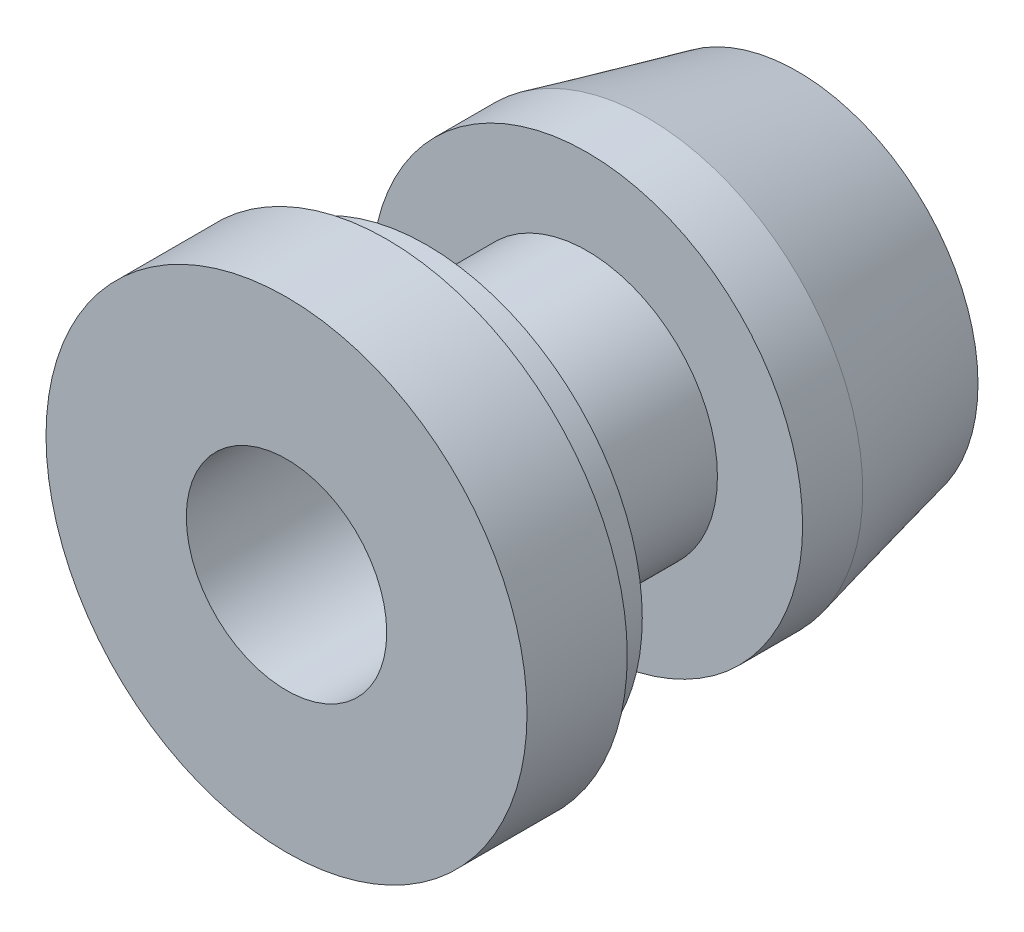
ISO-10303-21;
HEADER;
FILE_DESCRIPTION(('STEP AP214'),'2;1');
FILE_NAME('part.step','',(''),(''),'','','');
FILE_SCHEMA(('AUTOMOTIVE_DESIGN { 1 0 10303 214 1 1 1 1 }'));
ENDSEC;
DATA;
#1=APPLICATION_CONTEXT('core data for automotive mechanical design processes');
#2=APPLICATION_PROTOCOL_DEFINITION('international standard','automotive_design',2000,#1);
#3=PRODUCT_CONTEXT('',#1,'mechanical');
#4=PRODUCT('Part','Part','',(#3));
#5=PRODUCT_RELATED_PRODUCT_CATEGORY('part','',(#4));
#6=PRODUCT_DEFINITION_FORMATION('','',#4);
#7=PRODUCT_DEFINITION_CONTEXT('part definition',#1,'design');
#8=PRODUCT_DEFINITION('design','',#6,#7);
#9=PRODUCT_DEFINITION_SHAPE('','',#8);
#10=(LENGTH_UNIT() NAMED_UNIT(*) SI_UNIT(.MILLI.,.METRE.));
#11=(NAMED_UNIT(*) PLANE_ANGLE_UNIT() SI_UNIT($,.RADIAN.));
#12=(NAMED_UNIT(*) SI_UNIT($,.STERADIAN.) SOLID_ANGLE_UNIT());
#13=UNCERTAINTY_MEASURE_WITH_UNIT(LENGTH_MEASURE(1.E-05),#10,'distance_accuracy_value','');
#14=(GEOMETRIC_REPRESENTATION_CONTEXT(3) GLOBAL_UNCERTAINTY_ASSIGNED_CONTEXT((#13)) GLOBAL_UNIT_ASSIGNED_CONTEXT((#10,
#11,#12)) REPRESENTATION_CONTEXT('',''));
#15=CARTESIAN_POINT('',(0.,0.,0.));
#16=DIRECTION('',(0.,0.,1.));
#17=DIRECTION('',(1.,0.,0.));
#18=AXIS2_PLACEMENT_3D('',#15,#16,#17);
#19=CARTESIAN_POINT('',(0.,0.,-2.9946820181495));
#20=DIRECTION('',(0.,0.,-1.));
#21=DIRECTION('',(-1.,0.,0.));
#22=AXIS2_PLACEMENT_3D('',#19,#20,#21);
#23=CONICAL_SURFACE('',#22,0.,1.56931910907694);
#24=CARTESIAN_POINT('',(0.,0.,-3.));
#25=DIRECTION('',(0.,0.,1.));
#26=DIRECTION('',(1.,0.,0.));
#27=AXIS2_PLACEMENT_3D('',#24,#25,#26);
#28=CIRCLE('',#27,3.59999607209078);
#29=CARTESIAN_POINT('',(3.59999607209078,0.,-3.));
#30=VERTEX_POINT('',#29);
#31=EDGE_CURVE('E57',#30,#30,#28,.T.);
#32=ORIENTED_EDGE('',*,*,#31,.F.);
#33=EDGE_LOOP('',(#32));
#34=FACE_BOUND('',#33,.T.);
#35=CARTESIAN_POINT('',(0.,0.,-2.9991136745269));
#36=DIRECTION('',(0.,0.,-1.));
#37=DIRECTION('',(-1.,0.,0.));
#38=AXIS2_PLACEMENT_3D('',#35,#36,#37);
#39=CIRCLE('',#38,3.);
#40=CARTESIAN_POINT('',(-3.,0.,-2.9991136745269));
#41=VERTEX_POINT('',#40);
#42=EDGE_CURVE('E43',#41,#41,#39,.T.);
#43=ORIENTED_EDGE('',*,*,#42,.F.);
#44=EDGE_LOOP('',(#43));
#45=FACE_BOUND('',#44,.T.);
#46=ADVANCED_FACE('F39',(#34,#45),#23,.F.);
#47=CARTESIAN_POINT('',(0.,0.,1.2));
#48=DIRECTION('',(0.,0.,1.));
#49=DIRECTION('',(1.,0.,0.));
#50=AXIS2_PLACEMENT_3D('',#47,#48,#49);
#51=PLANE('',#50);
#52=CARTESIAN_POINT('',(0.,0.,1.2));
#53=DIRECTION('',(0.,0.,1.));
#54=DIRECTION('',(1.,0.,0.));
#55=AXIS2_PLACEMENT_3D('',#52,#53,#54);
#56=CIRCLE('',#55,4.3);
#57=CARTESIAN_POINT('',(4.3,0.,1.2));
#58=VERTEX_POINT('',#57);
#59=EDGE_CURVE('E10',#58,#58,#56,.T.);
#60=ORIENTED_EDGE('',*,*,#59,.T.);
#61=EDGE_LOOP('',(#60));
#62=FACE_BOUND('',#61,.T.);
#63=CARTESIAN_POINT('',(0.,0.,1.2));
#64=DIRECTION('',(0.,0.,1.));
#65=DIRECTION('',(1.,0.,0.));
#66=AXIS2_PLACEMENT_3D('',#63,#64,#65);
#67=CIRCLE('',#66,2.6);
#68=CARTESIAN_POINT('',(2.6,0.,1.2));
#69=VERTEX_POINT('',#68);
#70=EDGE_CURVE('E52',#69,#69,#67,.T.);
#71=ORIENTED_EDGE('',*,*,#70,.F.);
#72=EDGE_LOOP('',(#71));
#73=FACE_BOUND('',#72,.T.);
#74=ADVANCED_FACE('F109',(#62,#73),#51,.T.);
#75=CARTESIAN_POINT('',(0.,0.,1.2));
#76=DIRECTION('',(0.,0.,-1.));
#77=DIRECTION('',(-1.,0.,0.));
#78=AXIS2_PLACEMENT_3D('',#75,#76,#77);
#79=CYLINDRICAL_SURFACE('',#78,4.3);
#80=ORIENTED_EDGE('',*,*,#59,.F.);
#81=EDGE_LOOP('',(#80));
#82=FACE_BOUND('',#81,.T.);
#83=CARTESIAN_POINT('',(0.,0.,0.));
#84=DIRECTION('',(0.,0.,1.));
#85=DIRECTION('',(1.,0.,0.));
#86=AXIS2_PLACEMENT_3D('',#83,#84,#85);
#87=CIRCLE('',#86,4.3);
#88=CARTESIAN_POINT('',(4.3,0.,0.));
#89=VERTEX_POINT('',#88);
#90=EDGE_CURVE('E61',#89,#89,#87,.T.);
#91=ORIENTED_EDGE('',*,*,#90,.T.);
#92=EDGE_LOOP('',(#91));
#93=FACE_BOUND('',#92,.T.);
#94=ADVANCED_FACE('F41',(#82,#93),#79,.T.);
#95=CARTESIAN_POINT('',(0.,0.,1.2));
#96=DIRECTION('',(0.,0.,-1.));
#97=DIRECTION('',(-1.,0.,0.));
#98=AXIS2_PLACEMENT_3D('',#95,#96,#97);
#99=CYLINDRICAL_SURFACE('',#98,2.);
#100=CARTESIAN_POINT('',(0.,0.,0.));
#101=DIRECTION('',(0.,0.,1.));
#102=DIRECTION('',(1.,0.,0.));
#103=AXIS2_PLACEMENT_3D('',#100,#101,#102);
#104=CIRCLE('',#103,2.);
#105=CARTESIAN_POINT('',(2.,0.,0.));
#106=VERTEX_POINT('',#105);
#107=EDGE_CURVE('E55',#106,#106,#104,.T.);
#108=ORIENTED_EDGE('',*,*,#107,.F.);
#109=EDGE_LOOP('',(#108));
#110=FACE_BOUND('',#109,.T.);
#111=CARTESIAN_POINT('',(0.,0.,7.2));
#112=DIRECTION('',(0.,0.,1.));
#113=DIRECTION('',(1.,0.,0.));
#114=AXIS2_PLACEMENT_3D('',#111,#112,#113);
#115=CIRCLE('',#114,2.);
#116=CARTESIAN_POINT('',(2.,0.,7.2));
#117=VERTEX_POINT('',#116);
#118=EDGE_CURVE('E74',#117,#117,#115,.T.);
#119=ORIENTED_EDGE('',*,*,#118,.T.);
#120=EDGE_LOOP('',(#119));
#121=FACE_BOUND('',#120,.T.);
#122=ADVANCED_FACE('F104',(#110,#121),#99,.F.);
#123=CARTESIAN_POINT('',(0.,0.,4.4));
#124=DIRECTION('',(0.,0.,-1.));
#125=DIRECTION('',(-1.,0.,0.));
#126=AXIS2_PLACEMENT_3D('',#123,#124,#125);
#127=CYLINDRICAL_SURFACE('',#126,2.6);
#128=CARTESIAN_POINT('',(0.,0.,4.4));
#129=DIRECTION('',(0.,0.,1.));
#130=DIRECTION('',(1.,0.,0.));
#131=AXIS2_PLACEMENT_3D('',#128,#129,#130);
#132=CIRCLE('',#131,2.6);
#133=CARTESIAN_POINT('',(2.6,0.,4.4));
#134=VERTEX_POINT('',#133);
#135=EDGE_CURVE('E47',#134,#134,#132,.T.);
#136=ORIENTED_EDGE('',*,*,#135,.F.);
#137=EDGE_LOOP('',(#136));
#138=FACE_BOUND('',#137,.T.);
#139=ORIENTED_EDGE('',*,*,#70,.T.);
#140=EDGE_LOOP('',(#139));
#141=FACE_BOUND('',#140,.T.);
#142=ADVANCED_FACE('F94',(#138,#141),#127,.T.);
#143=CARTESIAN_POINT('',(0.,0.,4.4));
#144=DIRECTION('',(0.,0.,1.));
#145=DIRECTION('',(1.,0.,0.));
#146=AXIS2_PLACEMENT_3D('',#143,#144,#145);
#147=PLANE('',#146);
#148=ORIENTED_EDGE('',*,*,#135,.T.);
#149=EDGE_LOOP('',(#148));
#150=FACE_BOUND('',#149,.T.);
#151=CARTESIAN_POINT('',(0.,0.,4.4));
#152=DIRECTION('',(0.,0.,1.));
#153=DIRECTION('',(1.,0.,0.));
#154=AXIS2_PLACEMENT_3D('',#151,#152,#153);
#155=CIRCLE('',#154,4.3);
#156=CARTESIAN_POINT('',(4.3,0.,4.4));
#157=VERTEX_POINT('',#156);
#158=EDGE_CURVE('E81',#157,#157,#155,.T.);
#159=ORIENTED_EDGE('',*,*,#158,.F.);
#160=EDGE_LOOP('',(#159));
#161=FACE_BOUND('',#160,.T.);
#162=ADVANCED_FACE('F92',(#150,#161),#147,.F.);
#163=CARTESIAN_POINT('',(0.,0.,5.2));
#164=DIRECTION('',(0.,0.,-1.));
#165=DIRECTION('',(-1.,0.,0.));
#166=AXIS2_PLACEMENT_3D('',#163,#164,#165);
#167=CYLINDRICAL_SURFACE('',#166,4.3);
#168=CARTESIAN_POINT('',(0.,0.,5.2));
#169=DIRECTION('',(0.,0.,1.));
#170=DIRECTION('',(1.,0.,0.));
#171=AXIS2_PLACEMENT_3D('',#168,#169,#170);
#172=CIRCLE('',#171,4.3);
#173=CARTESIAN_POINT('',(4.3,0.,5.2));
#174=VERTEX_POINT('',#173);
#175=EDGE_CURVE('E84',#174,#174,#172,.T.);
#176=ORIENTED_EDGE('',*,*,#175,.F.);
#177=EDGE_LOOP('',(#176));
#178=FACE_BOUND('',#177,.T.);
#179=ORIENTED_EDGE('',*,*,#158,.T.);
#180=EDGE_LOOP('',(#179));
#181=FACE_BOUND('',#180,.T.);
#182=ADVANCED_FACE('F90',(#178,#181),#167,.T.);
#183=CARTESIAN_POINT('',(0.,0.,7.2));
#184=DIRECTION('',(0.,0.,1.));
#185=DIRECTION('',(1.,0.,0.));
#186=AXIS2_PLACEMENT_3D('',#183,#184,#185);
#187=PLANE('',#186);
#188=CARTESIAN_POINT('',(0.,0.,7.2));
#189=DIRECTION('',(0.,0.,1.));
#190=DIRECTION('',(1.,0.,0.));
#191=AXIS2_PLACEMENT_3D('',#188,#189,#190);
#192=CIRCLE('',#191,4.8);
#193=CARTESIAN_POINT('',(4.8,0.,7.2));
#194=VERTEX_POINT('',#193);
#195=EDGE_CURVE('E78',#194,#194,#192,.T.);
#196=ORIENTED_EDGE('',*,*,#195,.T.);
#197=EDGE_LOOP('',(#196));
#198=FACE_BOUND('',#197,.T.);
#199=ORIENTED_EDGE('',*,*,#118,.F.);
#200=EDGE_LOOP('',(#199));
#201=FACE_BOUND('',#200,.T.);
#202=ADVANCED_FACE('F101',(#198,#201),#187,.T.);
#203=CARTESIAN_POINT('',(0.,0.,5.2));
#204=DIRECTION('',(0.,0.,1.));
#205=DIRECTION('',(1.,0.,0.));
#206=AXIS2_PLACEMENT_3D('',#203,#204,#205);
#207=PLANE('',#206);
#208=ORIENTED_EDGE('',*,*,#175,.T.);
#209=EDGE_LOOP('',(#208));
#210=FACE_BOUND('',#209,.T.);
#211=CARTESIAN_POINT('',(0.,0.,5.2));
#212=DIRECTION('',(0.,0.,1.));
#213=DIRECTION('',(1.,0.,0.));
#214=AXIS2_PLACEMENT_3D('',#211,#212,#213);
#215=CIRCLE('',#214,4.8);
#216=CARTESIAN_POINT('',(4.8,0.,5.2));
#217=VERTEX_POINT('',#216);
#218=EDGE_CURVE('E77',#217,#217,#215,.T.);
#219=ORIENTED_EDGE('',*,*,#218,.F.);
#220=EDGE_LOOP('',(#219));
#221=FACE_BOUND('',#220,.T.);
#222=ADVANCED_FACE('F130',(#210,#221),#207,.F.);
#223=CARTESIAN_POINT('',(0.,0.,7.2));
#224=DIRECTION('',(0.,0.,-1.));
#225=DIRECTION('',(-1.,0.,0.));
#226=AXIS2_PLACEMENT_3D('',#223,#224,#225);
#227=CYLINDRICAL_SURFACE('',#226,4.8);
#228=ORIENTED_EDGE('',*,*,#195,.F.);
#229=EDGE_LOOP('',(#228));
#230=FACE_BOUND('',#229,.T.);
#231=ORIENTED_EDGE('',*,*,#218,.T.);
#232=EDGE_LOOP('',(#231));
#233=FACE_BOUND('',#232,.T.);
#234=ADVANCED_FACE('F126',(#230,#233),#227,.T.);
#235=CARTESIAN_POINT('',(0.,0.,-3.));
#236=DIRECTION('',(0.,0.,1.));
#237=DIRECTION('',(1.,0.,0.));
#238=AXIS2_PLACEMENT_3D('',#235,#236,#237);
#239=CONICAL_SURFACE('',#238,3.59999607209078,0.229233174976073);
#240=ORIENTED_EDGE('',*,*,#90,.F.);
#241=EDGE_LOOP('',(#240));
#242=FACE_BOUND('',#241,.T.);
#243=ORIENTED_EDGE('',*,*,#31,.T.);
#244=EDGE_LOOP('',(#243));
#245=FACE_BOUND('',#244,.T.);
#246=ADVANCED_FACE('F122',(#242,#245),#239,.T.);
#247=CARTESIAN_POINT('',(0.,0.,0.));
#248=DIRECTION('',(0.,0.,-1.));
#249=DIRECTION('',(-1.,0.,0.));
#250=AXIS2_PLACEMENT_3D('',#247,#248,#249);
#251=PLANE('',#250);
#252=CARTESIAN_POINT('',(0.,0.,0.));
#253=DIRECTION('',(0.,0.,-1.));
#254=DIRECTION('',(-1.,0.,0.));
#255=AXIS2_PLACEMENT_3D('',#252,#253,#254);
#256=CIRCLE('',#255,3.);
#257=CARTESIAN_POINT('',(-3.,0.,0.));
#258=VERTEX_POINT('',#257);
#259=EDGE_CURVE('E64',#258,#258,#256,.T.);
#260=ORIENTED_EDGE('',*,*,#259,.T.);
#261=EDGE_LOOP('',(#260));
#262=FACE_BOUND('',#261,.T.);
#263=ORIENTED_EDGE('',*,*,#107,.T.);
#264=EDGE_LOOP('',(#263));
#265=FACE_BOUND('',#264,.T.);
#266=ADVANCED_FACE('F125',(#262,#265),#251,.T.);
#267=CARTESIAN_POINT('',(0.,0.,-3.));
#268=DIRECTION('',(0.,0.,1.));
#269=DIRECTION('',(1.,0.,0.));
#270=AXIS2_PLACEMENT_3D('',#267,#268,#269);
#271=CYLINDRICAL_SURFACE('',#270,3.);
#272=ORIENTED_EDGE('',*,*,#259,.F.);
#273=EDGE_LOOP('',(#272));
#274=FACE_BOUND('',#273,.T.);
#275=ORIENTED_EDGE('',*,*,#42,.T.);
#276=EDGE_LOOP('',(#275));
#277=FACE_BOUND('',#276,.T.);
#278=ADVANCED_FACE('F120',(#274,#277),#271,.F.);
#279=CLOSED_SHELL('',(#46,#74,#94,#122,#142,#162,#182,#202,#222,#234,#246,#266,#278));
#280=MANIFOLD_SOLID_BREP('B2',#279);
#281=ADVANCED_BREP_SHAPE_REPRESENTATION('',(#18,#280),#14);
#282=SHAPE_DEFINITION_REPRESENTATION(#9,#281);
ENDSEC;
END-ISO-10303-21;
